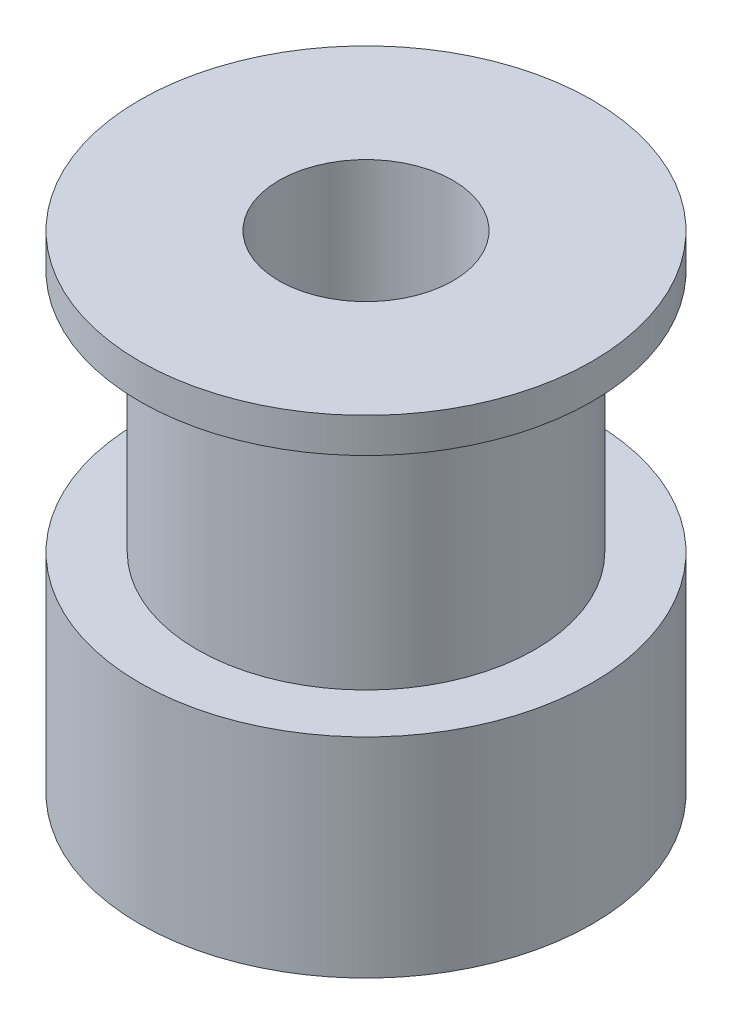
ISO-10303-21;
HEADER;
FILE_DESCRIPTION(('STEP AP214'),'2;1');
FILE_NAME('part.step','',(''),(''),'','','');
FILE_SCHEMA(('AUTOMOTIVE_DESIGN { 1 0 10303 214 1 1 1 1 }'));
ENDSEC;
DATA;
#1=APPLICATION_CONTEXT('core data for automotive mechanical design processes');
#2=APPLICATION_PROTOCOL_DEFINITION('international standard','automotive_design',2000,#1);
#3=PRODUCT_CONTEXT('',#1,'mechanical');
#4=PRODUCT('Part','Part','',(#3));
#5=PRODUCT_RELATED_PRODUCT_CATEGORY('part','',(#4));
#6=PRODUCT_DEFINITION_FORMATION('','',#4);
#7=PRODUCT_DEFINITION_CONTEXT('part definition',#1,'design');
#8=PRODUCT_DEFINITION('design','',#6,#7);
#9=PRODUCT_DEFINITION_SHAPE('','',#8);
#10=(LENGTH_UNIT() NAMED_UNIT(*) SI_UNIT(.MILLI.,.METRE.));
#11=(NAMED_UNIT(*) PLANE_ANGLE_UNIT() SI_UNIT($,.RADIAN.));
#12=(NAMED_UNIT(*) SI_UNIT($,.STERADIAN.) SOLID_ANGLE_UNIT());
#13=UNCERTAINTY_MEASURE_WITH_UNIT(LENGTH_MEASURE(1.E-05),#10,'distance_accuracy_value','');
#14=(GEOMETRIC_REPRESENTATION_CONTEXT(3) GLOBAL_UNCERTAINTY_ASSIGNED_CONTEXT((#13)) GLOBAL_UNIT_ASSIGNED_CONTEXT((#10,
#11,#12)) REPRESENTATION_CONTEXT('',''));
#15=CARTESIAN_POINT('',(0.,0.,0.));
#16=DIRECTION('',(0.,0.,1.));
#17=DIRECTION('',(1.,0.,0.));
#18=AXIS2_PLACEMENT_3D('',#15,#16,#17);
#19=CARTESIAN_POINT('',(0.,6.,0.));
#20=DIRECTION('',(0.,-1.,0.));
#21=DIRECTION('',(0.,0.,-1.));
#22=AXIS2_PLACEMENT_3D('',#19,#20,#21);
#23=CYLINDRICAL_SURFACE('',#22,6.5);
#24=CARTESIAN_POINT('',(0.,6.,0.));
#25=DIRECTION('',(0.,1.,0.));
#26=DIRECTION('',(0.,0.,1.));
#27=AXIS2_PLACEMENT_3D('',#24,#25,#26);
#28=CIRCLE('',#27,6.5);
#29=CARTESIAN_POINT('',(0.,6.,6.5));
#30=VERTEX_POINT('',#29);
#31=EDGE_CURVE('E39',#30,#30,#28,.T.);
#32=ORIENTED_EDGE('',*,*,#31,.F.);
#33=EDGE_LOOP('',(#32));
#34=FACE_BOUND('',#33,.T.);
#35=CARTESIAN_POINT('',(0.,0.,0.));
#36=DIRECTION('',(0.,1.,0.));
#37=DIRECTION('',(0.,0.,1.));
#38=AXIS2_PLACEMENT_3D('',#35,#36,#37);
#39=CIRCLE('',#38,6.5);
#40=CARTESIAN_POINT('',(0.,0.,6.5));
#41=VERTEX_POINT('',#40);
#42=EDGE_CURVE('E35',#41,#41,#39,.T.);
#43=ORIENTED_EDGE('',*,*,#42,.T.);
#44=EDGE_LOOP('',(#43));
#45=FACE_BOUND('',#44,.T.);
#46=ADVANCED_FACE('F32',(#34,#45),#23,.T.);
#47=CARTESIAN_POINT('',(0.,6.,0.));
#48=DIRECTION('',(0.,1.,0.));
#49=DIRECTION('',(0.,0.,1.));
#50=AXIS2_PLACEMENT_3D('',#47,#48,#49);
#51=PLANE('',#50);
#52=CARTESIAN_POINT('',(0.,6.,0.));
#53=DIRECTION('',(0.,1.,0.));
#54=DIRECTION('',(0.,0.,1.));
#55=AXIS2_PLACEMENT_3D('',#52,#53,#54);
#56=CIRCLE('',#55,4.85);
#57=CARTESIAN_POINT('',(0.,6.,4.85));
#58=VERTEX_POINT('',#57);
#59=EDGE_CURVE('E10',#58,#58,#56,.T.);
#60=ORIENTED_EDGE('',*,*,#59,.F.);
#61=EDGE_LOOP('',(#60));
#62=FACE_BOUND('',#61,.T.);
#63=ORIENTED_EDGE('',*,*,#31,.T.);
#64=EDGE_LOOP('',(#63));
#65=FACE_BOUND('',#64,.T.);
#66=ADVANCED_FACE('F86',(#62,#65),#51,.T.);
#67=CARTESIAN_POINT('',(0.,0.,0.));
#68=DIRECTION('',(0.,1.,0.));
#69=DIRECTION('',(0.,0.,1.));
#70=AXIS2_PLACEMENT_3D('',#67,#68,#69);
#71=PLANE('',#70);
#72=CARTESIAN_POINT('',(0.,0.,0.));
#73=DIRECTION('',(0.,1.,0.));
#74=DIRECTION('',(0.,0.,1.));
#75=AXIS2_PLACEMENT_3D('',#72,#73,#74);
#76=CIRCLE('',#75,2.5);
#77=CARTESIAN_POINT('',(0.,0.,2.5));
#78=VERTEX_POINT('',#77);
#79=EDGE_CURVE('E52',#78,#78,#76,.F.);
#80=ORIENTED_EDGE('',*,*,#79,.F.);
#81=EDGE_LOOP('',(#80));
#82=FACE_BOUND('',#81,.T.);
#83=ORIENTED_EDGE('',*,*,#42,.F.);
#84=EDGE_LOOP('',(#83));
#85=FACE_BOUND('',#84,.T.);
#86=ADVANCED_FACE('F91',(#82,#85),#71,.F.);
#87=CARTESIAN_POINT('',(0.,13.,0.));
#88=DIRECTION('',(0.,-1.,0.));
#89=DIRECTION('',(0.,0.,-1.));
#90=AXIS2_PLACEMENT_3D('',#87,#88,#89);
#91=CYLINDRICAL_SURFACE('',#90,4.85);
#92=CARTESIAN_POINT('',(0.,13.,0.));
#93=DIRECTION('',(0.,1.,0.));
#94=DIRECTION('',(0.,0.,1.));
#95=AXIS2_PLACEMENT_3D('',#92,#93,#94);
#96=CIRCLE('',#95,4.85);
#97=CARTESIAN_POINT('',(0.,13.,4.85));
#98=VERTEX_POINT('',#97);
#99=EDGE_CURVE('E45',#98,#98,#96,.T.);
#100=ORIENTED_EDGE('',*,*,#99,.F.);
#101=EDGE_LOOP('',(#100));
#102=FACE_BOUND('',#101,.T.);
#103=ORIENTED_EDGE('',*,*,#59,.T.);
#104=EDGE_LOOP('',(#103));
#105=FACE_BOUND('',#104,.T.);
#106=ADVANCED_FACE('F74',(#102,#105),#91,.T.);
#107=CARTESIAN_POINT('',(0.,14.,0.));
#108=DIRECTION('',(0.,-1.,0.));
#109=DIRECTION('',(0.,0.,-1.));
#110=AXIS2_PLACEMENT_3D('',#107,#108,#109);
#111=CYLINDRICAL_SURFACE('',#110,6.5);
#112=CARTESIAN_POINT('',(0.,14.,0.));
#113=DIRECTION('',(0.,1.,0.));
#114=DIRECTION('',(0.,0.,1.));
#115=AXIS2_PLACEMENT_3D('',#112,#113,#114);
#116=CIRCLE('',#115,6.5);
#117=CARTESIAN_POINT('',(0.,14.,6.5));
#118=VERTEX_POINT('',#117);
#119=EDGE_CURVE('E48',#118,#118,#116,.T.);
#120=ORIENTED_EDGE('',*,*,#119,.F.);
#121=EDGE_LOOP('',(#120));
#122=FACE_BOUND('',#121,.T.);
#123=CARTESIAN_POINT('',(0.,13.,0.));
#124=DIRECTION('',(0.,1.,0.));
#125=DIRECTION('',(0.,0.,1.));
#126=AXIS2_PLACEMENT_3D('',#123,#124,#125);
#127=CIRCLE('',#126,6.5);
#128=CARTESIAN_POINT('',(0.,13.,6.5));
#129=VERTEX_POINT('',#128);
#130=EDGE_CURVE('E49',#129,#129,#127,.T.);
#131=ORIENTED_EDGE('',*,*,#130,.T.);
#132=EDGE_LOOP('',(#131));
#133=FACE_BOUND('',#132,.T.);
#134=ADVANCED_FACE('F68',(#122,#133),#111,.T.);
#135=CARTESIAN_POINT('',(0.,14.,0.));
#136=DIRECTION('',(0.,1.,0.));
#137=DIRECTION('',(0.,0.,1.));
#138=AXIS2_PLACEMENT_3D('',#135,#136,#137);
#139=PLANE('',#138);
#140=CARTESIAN_POINT('',(0.,14.,0.));
#141=DIRECTION('',(0.,1.,0.));
#142=DIRECTION('',(0.,0.,1.));
#143=AXIS2_PLACEMENT_3D('',#140,#141,#142);
#144=CIRCLE('',#143,2.5);
#145=CARTESIAN_POINT('',(0.,14.,2.5));
#146=VERTEX_POINT('',#145);
#147=EDGE_CURVE('E57',#146,#146,#144,.T.);
#148=ORIENTED_EDGE('',*,*,#147,.F.);
#149=EDGE_LOOP('',(#148));
#150=FACE_BOUND('',#149,.T.);
#151=ORIENTED_EDGE('',*,*,#119,.T.);
#152=EDGE_LOOP('',(#151));
#153=FACE_BOUND('',#152,.T.);
#154=ADVANCED_FACE('F64',(#150,#153),#139,.T.);
#155=CARTESIAN_POINT('',(0.,13.,0.));
#156=DIRECTION('',(0.,1.,0.));
#157=DIRECTION('',(0.,0.,1.));
#158=AXIS2_PLACEMENT_3D('',#155,#156,#157);
#159=PLANE('',#158);
#160=ORIENTED_EDGE('',*,*,#99,.T.);
#161=EDGE_LOOP('',(#160));
#162=FACE_BOUND('',#161,.T.);
#163=ORIENTED_EDGE('',*,*,#130,.F.);
#164=EDGE_LOOP('',(#163));
#165=FACE_BOUND('',#164,.T.);
#166=ADVANCED_FACE('F67',(#162,#165),#159,.F.);
#167=CARTESIAN_POINT('',(0.,-0.000999999999999265,0.));
#168=DIRECTION('',(0.,1.,0.));
#169=DIRECTION('',(0.,0.,1.));
#170=AXIS2_PLACEMENT_3D('',#167,#168,#169);
#171=CYLINDRICAL_SURFACE('',#170,2.5);
#172=ORIENTED_EDGE('',*,*,#147,.T.);
#173=EDGE_LOOP('',(#172));
#174=FACE_BOUND('',#173,.T.);
#175=ORIENTED_EDGE('',*,*,#79,.T.);
#176=EDGE_LOOP('',(#175));
#177=FACE_BOUND('',#176,.T.);
#178=ADVANCED_FACE('F61',(#174,#177),#171,.F.);
#179=CLOSED_SHELL('',(#46,#66,#86,#106,#134,#154,#166,#178));
#180=MANIFOLD_SOLID_BREP('B2',#179);
#181=ADVANCED_BREP_SHAPE_REPRESENTATION('',(#18,#180),#14);
#182=SHAPE_DEFINITION_REPRESENTATION(#9,#181);
ENDSEC;
END-ISO-10303-21;
